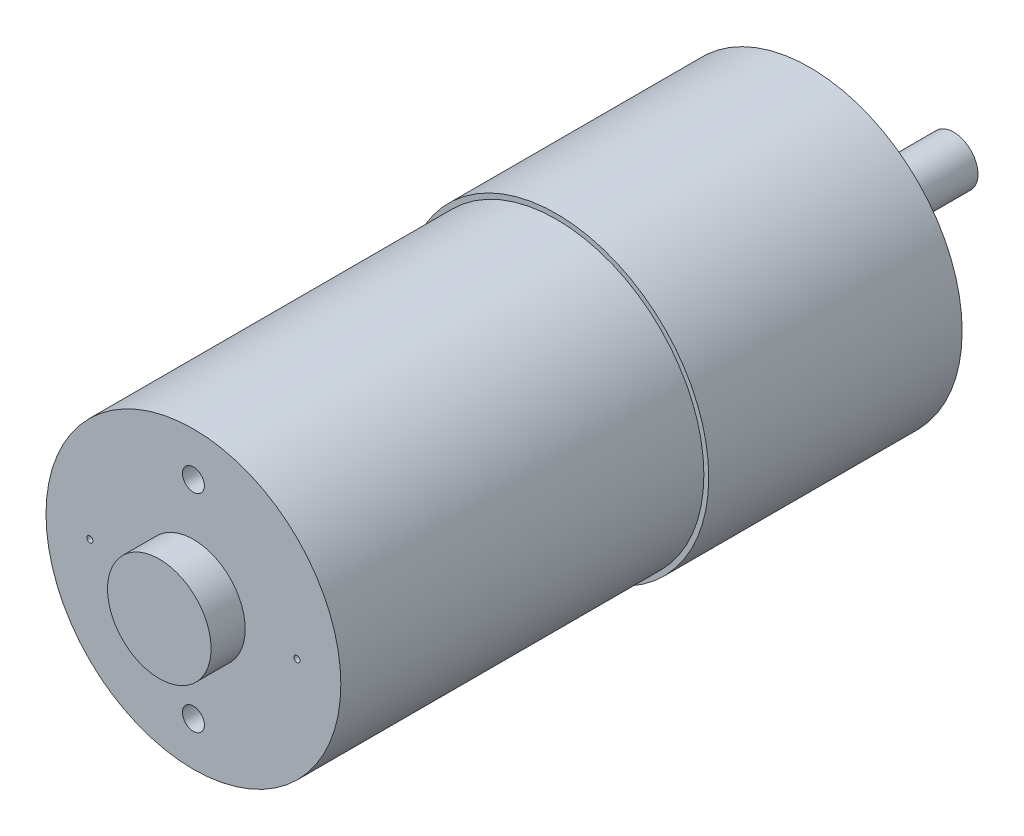
ISO-10303-21;
HEADER;
FILE_DESCRIPTION(('STEP AP214'),'2;1');
FILE_NAME('part.step','',(''),(''),'','','');
FILE_SCHEMA(('AUTOMOTIVE_DESIGN { 1 0 10303 214 1 1 1 1 }'));
ENDSEC;
DATA;
#1=APPLICATION_CONTEXT('core data for automotive mechanical design processes');
#2=APPLICATION_PROTOCOL_DEFINITION('international standard','automotive_design',2000,#1);
#3=PRODUCT_CONTEXT('',#1,'mechanical');
#4=PRODUCT('Part','Part','',(#3));
#5=PRODUCT_RELATED_PRODUCT_CATEGORY('part','',(#4));
#6=PRODUCT_DEFINITION_FORMATION('','',#4);
#7=PRODUCT_DEFINITION_CONTEXT('part definition',#1,'design');
#8=PRODUCT_DEFINITION('design','',#6,#7);
#9=PRODUCT_DEFINITION_SHAPE('','',#8);
#10=(LENGTH_UNIT() NAMED_UNIT(*) SI_UNIT(.MILLI.,.METRE.));
#11=(NAMED_UNIT(*) PLANE_ANGLE_UNIT() SI_UNIT($,.RADIAN.));
#12=(NAMED_UNIT(*) SI_UNIT($,.STERADIAN.) SOLID_ANGLE_UNIT());
#13=UNCERTAINTY_MEASURE_WITH_UNIT(LENGTH_MEASURE(1.E-05),#10,'distance_accuracy_value','');
#14=(GEOMETRIC_REPRESENTATION_CONTEXT(3) GLOBAL_UNCERTAINTY_ASSIGNED_CONTEXT((#13)) GLOBAL_UNIT_ASSIGNED_CONTEXT((#10,
#11,#12)) REPRESENTATION_CONTEXT('',''));
#15=CARTESIAN_POINT('',(0.,0.,0.));
#16=DIRECTION('',(0.,0.,1.));
#17=DIRECTION('',(1.,0.,0.));
#18=AXIS2_PLACEMENT_3D('',#15,#16,#17);
#19=CARTESIAN_POINT('',(0.,0.,50.6));
#20=DIRECTION('',(0.,0.,1.));
#21=DIRECTION('',(1.,0.,0.));
#22=AXIS2_PLACEMENT_3D('',#19,#20,#21);
#23=PLANE('',#22);
#24=CARTESIAN_POINT('',(-8.5,0.,50.6));
#25=DIRECTION('',(0.,0.,1.));
#26=DIRECTION('',(1.,0.,0.));
#27=AXIS2_PLACEMENT_3D('',#24,#25,#26);
#28=CIRCLE('',#27,0.25);
#29=CARTESIAN_POINT('',(-8.25,0.,50.6));
#30=VERTEX_POINT('',#29);
#31=EDGE_CURVE('E65',#30,#30,#28,.T.);
#32=ORIENTED_EDGE('',*,*,#31,.F.);
#33=EDGE_LOOP('',(#32));
#34=FACE_BOUND('',#33,.T.);
#35=CARTESIAN_POINT('',(0.,-8.5,50.6));
#36=DIRECTION('',(0.,0.,1.));
#37=DIRECTION('',(1.,0.,0.));
#38=AXIS2_PLACEMENT_3D('',#35,#36,#37);
#39=CIRCLE('',#38,0.9);
#40=CARTESIAN_POINT('',(0.900000000000001,-8.5,50.6));
#41=VERTEX_POINT('',#40);
#42=EDGE_CURVE('E54',#41,#41,#39,.T.);
#43=ORIENTED_EDGE('',*,*,#42,.F.);
#44=EDGE_LOOP('',(#43));
#45=FACE_BOUND('',#44,.T.);
#46=CARTESIAN_POINT('',(0.,8.5,50.6));
#47=DIRECTION('',(0.,0.,1.));
#48=DIRECTION('',(1.,0.,0.));
#49=AXIS2_PLACEMENT_3D('',#46,#47,#48);
#50=CIRCLE('',#49,0.9);
#51=CARTESIAN_POINT('',(0.9,8.5,50.6));
#52=VERTEX_POINT('',#51);
#53=EDGE_CURVE('E46',#52,#52,#50,.T.);
#54=ORIENTED_EDGE('',*,*,#53,.F.);
#55=EDGE_LOOP('',(#54));
#56=FACE_BOUND('',#55,.T.);
#57=CARTESIAN_POINT('',(8.5,0.,50.6));
#58=DIRECTION('',(0.,0.,1.));
#59=DIRECTION('',(1.,0.,0.));
#60=AXIS2_PLACEMENT_3D('',#57,#58,#59);
#61=CIRCLE('',#60,0.25);
#62=CARTESIAN_POINT('',(8.75,0.,50.6));
#63=VERTEX_POINT('',#62);
#64=EDGE_CURVE('E59',#63,#63,#61,.T.);
#65=ORIENTED_EDGE('',*,*,#64,.F.);
#66=EDGE_LOOP('',(#65));
#67=FACE_BOUND('',#66,.T.);
#68=CARTESIAN_POINT('',(0.,0.,50.6));
#69=DIRECTION('',(0.,0.,1.));
#70=DIRECTION('',(1.,0.,0.));
#71=AXIS2_PLACEMENT_3D('',#68,#69,#70);
#72=CIRCLE('',#71,4.25);
#73=CARTESIAN_POINT('',(4.25,0.,50.6));
#74=VERTEX_POINT('',#73);
#75=EDGE_CURVE('E83',#74,#74,#72,.T.);
#76=ORIENTED_EDGE('',*,*,#75,.F.);
#77=EDGE_LOOP('',(#76));
#78=FACE_BOUND('',#77,.T.);
#79=CARTESIAN_POINT('',(0.,0.,50.6));
#80=DIRECTION('',(0.,0.,1.));
#81=DIRECTION('',(1.,0.,0.));
#82=AXIS2_PLACEMENT_3D('',#79,#80,#81);
#83=CIRCLE('',#82,12.1);
#84=CARTESIAN_POINT('',(12.1,0.,50.6));
#85=VERTEX_POINT('',#84);
#86=EDGE_CURVE('E92',#85,#85,#83,.T.);
#87=ORIENTED_EDGE('',*,*,#86,.T.);
#88=EDGE_LOOP('',(#87));
#89=FACE_BOUND('',#88,.T.);
#90=ADVANCED_FACE('F38',(#34,#45,#56,#67,#78,#89),#23,.T.);
#91=CARTESIAN_POINT('',(0.,0.,50.6));
#92=DIRECTION('',(0.,0.,-1.));
#93=DIRECTION('',(-1.,0.,0.));
#94=AXIS2_PLACEMENT_3D('',#91,#92,#93);
#95=CYLINDRICAL_SURFACE('',#94,12.5);
#96=CARTESIAN_POINT('',(0.,0.,0.));
#97=DIRECTION('',(0.,0.,1.));
#98=DIRECTION('',(1.,0.,0.));
#99=AXIS2_PLACEMENT_3D('',#96,#97,#98);
#100=CIRCLE('',#99,12.5);
#101=CARTESIAN_POINT('',(12.5,0.,0.));
#102=VERTEX_POINT('',#101);
#103=EDGE_CURVE('E10',#102,#102,#100,.T.);
#104=ORIENTED_EDGE('',*,*,#103,.T.);
#105=EDGE_LOOP('',(#104));
#106=FACE_BOUND('',#105,.T.);
#107=CARTESIAN_POINT('',(0.,0.,20.8));
#108=DIRECTION('',(0.,0.,1.));
#109=DIRECTION('',(1.,0.,0.));
#110=AXIS2_PLACEMENT_3D('',#107,#108,#109);
#111=CIRCLE('',#110,12.5);
#112=CARTESIAN_POINT('',(12.5,0.,20.8));
#113=VERTEX_POINT('',#112);
#114=EDGE_CURVE('E86',#113,#113,#111,.T.);
#115=ORIENTED_EDGE('',*,*,#114,.F.);
#116=EDGE_LOOP('',(#115));
#117=FACE_BOUND('',#116,.T.);
#118=ADVANCED_FACE('F40',(#106,#117),#95,.T.);
#119=CARTESIAN_POINT('',(0.,0.,0.));
#120=DIRECTION('',(0.,0.,1.));
#121=DIRECTION('',(1.,0.,0.));
#122=AXIS2_PLACEMENT_3D('',#119,#120,#121);
#123=PLANE('',#122);
#124=CARTESIAN_POINT('',(0.,0.,0.));
#125=DIRECTION('',(0.,0.,1.));
#126=DIRECTION('',(1.,0.,0.));
#127=AXIS2_PLACEMENT_3D('',#124,#125,#126);
#128=CIRCLE('',#127,3.5);
#129=CARTESIAN_POINT('',(3.5,0.,0.));
#130=VERTEX_POINT('',#129);
#131=EDGE_CURVE('E74',#130,#130,#128,.T.);
#132=ORIENTED_EDGE('',*,*,#131,.T.);
#133=EDGE_LOOP('',(#132));
#134=FACE_BOUND('',#133,.T.);
#135=ORIENTED_EDGE('',*,*,#103,.F.);
#136=EDGE_LOOP('',(#135));
#137=FACE_BOUND('',#136,.T.);
#138=CARTESIAN_POINT('',(0.,8.5,0.));
#139=DIRECTION('',(0.,0.,1.));
#140=DIRECTION('',(1.,0.,0.));
#141=AXIS2_PLACEMENT_3D('',#138,#139,#140);
#142=CIRCLE('',#141,0.9);
#143=CARTESIAN_POINT('',(0.9,8.5,0.));
#144=VERTEX_POINT('',#143);
#145=EDGE_CURVE('E50',#144,#144,#142,.T.);
#146=ORIENTED_EDGE('',*,*,#145,.T.);
#147=EDGE_LOOP('',(#146));
#148=FACE_BOUND('',#147,.T.);
#149=CARTESIAN_POINT('',(0.,-8.5,0.));
#150=DIRECTION('',(0.,0.,1.));
#151=DIRECTION('',(1.,0.,0.));
#152=AXIS2_PLACEMENT_3D('',#149,#150,#151);
#153=CIRCLE('',#152,0.9);
#154=CARTESIAN_POINT('',(0.900000000000001,-8.5,0.));
#155=VERTEX_POINT('',#154);
#156=EDGE_CURVE('E56',#155,#155,#153,.T.);
#157=ORIENTED_EDGE('',*,*,#156,.T.);
#158=EDGE_LOOP('',(#157));
#159=FACE_BOUND('',#158,.T.);
#160=CARTESIAN_POINT('',(8.5,0.,0.));
#161=DIRECTION('',(0.,0.,1.));
#162=DIRECTION('',(1.,0.,0.));
#163=AXIS2_PLACEMENT_3D('',#160,#161,#162);
#164=CIRCLE('',#163,0.25);
#165=CARTESIAN_POINT('',(8.75,0.,0.));
#166=VERTEX_POINT('',#165);
#167=EDGE_CURVE('E62',#166,#166,#164,.T.);
#168=ORIENTED_EDGE('',*,*,#167,.T.);
#169=EDGE_LOOP('',(#168));
#170=FACE_BOUND('',#169,.T.);
#171=CARTESIAN_POINT('',(-8.5,0.,0.));
#172=DIRECTION('',(0.,0.,1.));
#173=DIRECTION('',(1.,0.,0.));
#174=AXIS2_PLACEMENT_3D('',#171,#172,#173);
#175=CIRCLE('',#174,0.25);
#176=CARTESIAN_POINT('',(-8.25,0.,0.));
#177=VERTEX_POINT('',#176);
#178=EDGE_CURVE('E68',#177,#177,#175,.T.);
#179=ORIENTED_EDGE('',*,*,#178,.T.);
#180=EDGE_LOOP('',(#179));
#181=FACE_BOUND('',#180,.T.);
#182=ADVANCED_FACE('F109',(#134,#137,#148,#159,#170,#181),#123,.F.);
#183=CARTESIAN_POINT('',(0.,8.5,50.6));
#184=DIRECTION('',(0.,0.,-1.));
#185=DIRECTION('',(-1.,0.,0.));
#186=AXIS2_PLACEMENT_3D('',#183,#184,#185);
#187=CYLINDRICAL_SURFACE('',#186,0.9);
#188=ORIENTED_EDGE('',*,*,#53,.T.);
#189=EDGE_LOOP('',(#188));
#190=FACE_BOUND('',#189,.T.);
#191=ORIENTED_EDGE('',*,*,#145,.F.);
#192=EDGE_LOOP('',(#191));
#193=FACE_BOUND('',#192,.T.);
#194=ADVANCED_FACE('F114',(#190,#193),#187,.F.);
#195=CARTESIAN_POINT('',(0.,-8.5,50.6));
#196=DIRECTION('',(0.,0.,-1.));
#197=DIRECTION('',(-1.,0.,0.));
#198=AXIS2_PLACEMENT_3D('',#195,#196,#197);
#199=CYLINDRICAL_SURFACE('',#198,0.9);
#200=ORIENTED_EDGE('',*,*,#42,.T.);
#201=EDGE_LOOP('',(#200));
#202=FACE_BOUND('',#201,.T.);
#203=ORIENTED_EDGE('',*,*,#156,.F.);
#204=EDGE_LOOP('',(#203));
#205=FACE_BOUND('',#204,.T.);
#206=ADVANCED_FACE('F125',(#202,#205),#199,.F.);
#207=CARTESIAN_POINT('',(8.5,0.,50.6));
#208=DIRECTION('',(0.,0.,-1.));
#209=DIRECTION('',(-1.,0.,0.));
#210=AXIS2_PLACEMENT_3D('',#207,#208,#209);
#211=CYLINDRICAL_SURFACE('',#210,0.25);
#212=ORIENTED_EDGE('',*,*,#64,.T.);
#213=EDGE_LOOP('',(#212));
#214=FACE_BOUND('',#213,.T.);
#215=ORIENTED_EDGE('',*,*,#167,.F.);
#216=EDGE_LOOP('',(#215));
#217=FACE_BOUND('',#216,.T.);
#218=ADVANCED_FACE('F129',(#214,#217),#211,.F.);
#219=CARTESIAN_POINT('',(-8.5,0.,50.6));
#220=DIRECTION('',(0.,0.,-1.));
#221=DIRECTION('',(-1.,0.,0.));
#222=AXIS2_PLACEMENT_3D('',#219,#220,#221);
#223=CYLINDRICAL_SURFACE('',#222,0.25);
#224=ORIENTED_EDGE('',*,*,#31,.T.);
#225=EDGE_LOOP('',(#224));
#226=FACE_BOUND('',#225,.T.);
#227=ORIENTED_EDGE('',*,*,#178,.F.);
#228=EDGE_LOOP('',(#227));
#229=FACE_BOUND('',#228,.T.);
#230=ADVANCED_FACE('F133',(#226,#229),#223,.F.);
#231=CARTESIAN_POINT('',(0.,0.,-2.));
#232=DIRECTION('',(0.,0.,1.));
#233=DIRECTION('',(1.,0.,0.));
#234=AXIS2_PLACEMENT_3D('',#231,#232,#233);
#235=CYLINDRICAL_SURFACE('',#234,3.5);
#236=CARTESIAN_POINT('',(0.,0.,-2.));
#237=DIRECTION('',(0.,0.,1.));
#238=DIRECTION('',(1.,0.,0.));
#239=AXIS2_PLACEMENT_3D('',#236,#237,#238);
#240=CIRCLE('',#239,3.5);
#241=CARTESIAN_POINT('',(3.5,0.,-2.));
#242=VERTEX_POINT('',#241);
#243=EDGE_CURVE('E71',#242,#242,#240,.T.);
#244=ORIENTED_EDGE('',*,*,#243,.T.);
#245=EDGE_LOOP('',(#244));
#246=FACE_BOUND('',#245,.T.);
#247=ORIENTED_EDGE('',*,*,#131,.F.);
#248=EDGE_LOOP('',(#247));
#249=FACE_BOUND('',#248,.T.);
#250=ADVANCED_FACE('F137',(#246,#249),#235,.T.);
#251=CARTESIAN_POINT('',(0.,0.,-2.));
#252=DIRECTION('',(0.,0.,1.));
#253=DIRECTION('',(1.,0.,0.));
#254=AXIS2_PLACEMENT_3D('',#251,#252,#253);
#255=PLANE('',#254);
#256=CARTESIAN_POINT('',(0.,0.,-2.));
#257=DIRECTION('',(0.,0.,1.));
#258=DIRECTION('',(1.,0.,0.));
#259=AXIS2_PLACEMENT_3D('',#256,#257,#258);
#260=CIRCLE('',#259,2.);
#261=CARTESIAN_POINT('',(2.,0.,-2.));
#262=VERTEX_POINT('',#261);
#263=EDGE_CURVE('E42',#262,#262,#260,.T.);
#264=ORIENTED_EDGE('',*,*,#263,.T.);
#265=EDGE_LOOP('',(#264));
#266=FACE_BOUND('',#265,.T.);
#267=ORIENTED_EDGE('',*,*,#243,.F.);
#268=EDGE_LOOP('',(#267));
#269=FACE_BOUND('',#268,.T.);
#270=ADVANCED_FACE('F141',(#266,#269),#255,.F.);
#271=CARTESIAN_POINT('',(0.,0.,-11.8));
#272=DIRECTION('',(0.,0.,1.));
#273=DIRECTION('',(1.,0.,0.));
#274=AXIS2_PLACEMENT_3D('',#271,#272,#273);
#275=CYLINDRICAL_SURFACE('',#274,2.);
#276=CARTESIAN_POINT('',(0.,0.,-11.8));
#277=DIRECTION('',(0.,0.,1.));
#278=DIRECTION('',(1.,0.,0.));
#279=AXIS2_PLACEMENT_3D('',#276,#277,#278);
#280=CIRCLE('',#279,2.);
#281=CARTESIAN_POINT('',(2.,0.,-11.8));
#282=VERTEX_POINT('',#281);
#283=EDGE_CURVE('E79',#282,#282,#280,.T.);
#284=ORIENTED_EDGE('',*,*,#283,.T.);
#285=EDGE_LOOP('',(#284));
#286=FACE_BOUND('',#285,.T.);
#287=ORIENTED_EDGE('',*,*,#263,.F.);
#288=EDGE_LOOP('',(#287));
#289=FACE_BOUND('',#288,.T.);
#290=ADVANCED_FACE('F145',(#286,#289),#275,.T.);
#291=CARTESIAN_POINT('',(0.,0.,-11.8));
#292=DIRECTION('',(0.,0.,1.));
#293=DIRECTION('',(1.,0.,0.));
#294=AXIS2_PLACEMENT_3D('',#291,#292,#293);
#295=PLANE('',#294);
#296=ORIENTED_EDGE('',*,*,#283,.F.);
#297=EDGE_LOOP('',(#296));
#298=FACE_BOUND('',#297,.T.);
#299=ADVANCED_FACE('F149',(#298),#295,.F.);
#300=CARTESIAN_POINT('',(0.,0.,53.4));
#301=DIRECTION('',(0.,0.,-1.));
#302=DIRECTION('',(-1.,0.,0.));
#303=AXIS2_PLACEMENT_3D('',#300,#301,#302);
#304=CYLINDRICAL_SURFACE('',#303,4.25);
#305=CARTESIAN_POINT('',(0.,0.,53.4));
#306=DIRECTION('',(0.,0.,1.));
#307=DIRECTION('',(1.,0.,0.));
#308=AXIS2_PLACEMENT_3D('',#305,#306,#307);
#309=CIRCLE('',#308,4.25);
#310=CARTESIAN_POINT('',(4.25,0.,53.4));
#311=VERTEX_POINT('',#310);
#312=EDGE_CURVE('E82',#311,#311,#309,.T.);
#313=ORIENTED_EDGE('',*,*,#312,.F.);
#314=EDGE_LOOP('',(#313));
#315=FACE_BOUND('',#314,.T.);
#316=ORIENTED_EDGE('',*,*,#75,.T.);
#317=EDGE_LOOP('',(#316));
#318=FACE_BOUND('',#317,.T.);
#319=ADVANCED_FACE('F153',(#315,#318),#304,.T.);
#320=CARTESIAN_POINT('',(0.,0.,53.4));
#321=DIRECTION('',(0.,0.,1.));
#322=DIRECTION('',(1.,0.,0.));
#323=AXIS2_PLACEMENT_3D('',#320,#321,#322);
#324=PLANE('',#323);
#325=ORIENTED_EDGE('',*,*,#312,.T.);
#326=EDGE_LOOP('',(#325));
#327=FACE_BOUND('',#326,.T.);
#328=ADVANCED_FACE('F104',(#327),#324,.T.);
#329=CARTESIAN_POINT('',(0.,0.,20.8));
#330=DIRECTION('',(0.,0.,1.));
#331=DIRECTION('',(1.,0.,0.));
#332=AXIS2_PLACEMENT_3D('',#329,#330,#331);
#333=PLANE('',#332);
#334=CARTESIAN_POINT('',(0.,0.,20.8));
#335=DIRECTION('',(0.,0.,1.));
#336=DIRECTION('',(1.,0.,0.));
#337=AXIS2_PLACEMENT_3D('',#334,#335,#336);
#338=CIRCLE('',#337,12.1);
#339=CARTESIAN_POINT('',(12.1,0.,20.8));
#340=VERTEX_POINT('',#339);
#341=EDGE_CURVE('E91',#340,#340,#338,.T.);
#342=ORIENTED_EDGE('',*,*,#341,.F.);
#343=EDGE_LOOP('',(#342));
#344=FACE_BOUND('',#343,.T.);
#345=ORIENTED_EDGE('',*,*,#114,.T.);
#346=EDGE_LOOP('',(#345));
#347=FACE_BOUND('',#346,.T.);
#348=ADVANCED_FACE('F101',(#344,#347),#333,.T.);
#349=CARTESIAN_POINT('',(0.,0.,20.8));
#350=DIRECTION('',(0.,0.,1.));
#351=DIRECTION('',(1.,0.,0.));
#352=AXIS2_PLACEMENT_3D('',#349,#350,#351);
#353=CYLINDRICAL_SURFACE('',#352,12.1);
#354=ORIENTED_EDGE('',*,*,#341,.T.);
#355=EDGE_LOOP('',(#354));
#356=FACE_BOUND('',#355,.T.);
#357=ORIENTED_EDGE('',*,*,#86,.F.);
#358=EDGE_LOOP('',(#357));
#359=FACE_BOUND('',#358,.T.);
#360=ADVANCED_FACE('F98',(#356,#359),#353,.T.);
#361=CLOSED_SHELL('',(#90,#118,#182,#194,#206,#218,#230,#250,#270,#290,#299,#319,#328,#348,#360));
#362=MANIFOLD_SOLID_BREP('B2',#361);
#363=ADVANCED_BREP_SHAPE_REPRESENTATION('',(#18,#362),#14);
#364=SHAPE_DEFINITION_REPRESENTATION(#9,#363);
ENDSEC;
END-ISO-10303-21;
